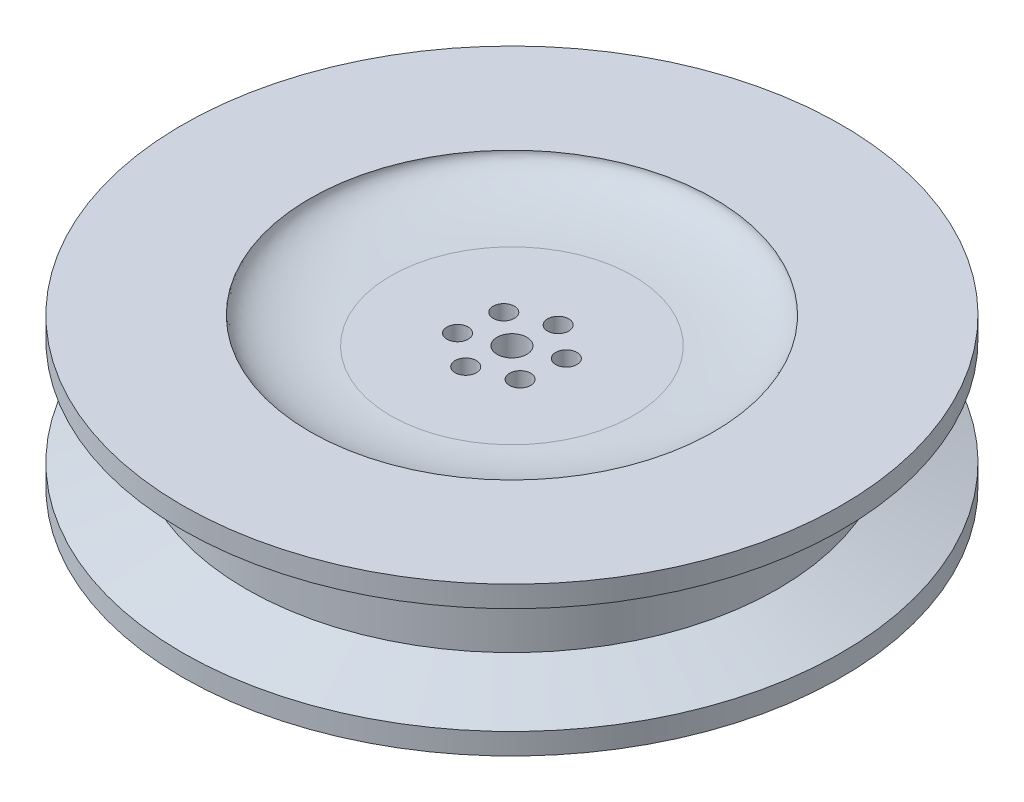
ISO-10303-21;
HEADER;
FILE_DESCRIPTION(('STEP AP214'),'2;1');
FILE_NAME('part.step','',(''),(''),'','','');
FILE_SCHEMA(('AUTOMOTIVE_DESIGN { 1 0 10303 214 1 1 1 1 }'));
ENDSEC;
DATA;
#1=APPLICATION_CONTEXT('core data for automotive mechanical design processes');
#2=APPLICATION_PROTOCOL_DEFINITION('international standard','automotive_design',2000,#1);
#3=PRODUCT_CONTEXT('',#1,'mechanical');
#4=PRODUCT('Part','Part','',(#3));
#5=PRODUCT_RELATED_PRODUCT_CATEGORY('part','',(#4));
#6=PRODUCT_DEFINITION_FORMATION('','',#4);
#7=PRODUCT_DEFINITION_CONTEXT('part definition',#1,'design');
#8=PRODUCT_DEFINITION('design','',#6,#7);
#9=PRODUCT_DEFINITION_SHAPE('','',#8);
#10=(LENGTH_UNIT() NAMED_UNIT(*) SI_UNIT(.MILLI.,.METRE.));
#11=(NAMED_UNIT(*) PLANE_ANGLE_UNIT() SI_UNIT($,.RADIAN.));
#12=(NAMED_UNIT(*) SI_UNIT($,.STERADIAN.) SOLID_ANGLE_UNIT());
#13=UNCERTAINTY_MEASURE_WITH_UNIT(LENGTH_MEASURE(1.E-05),#10,'distance_accuracy_value','');
#14=(GEOMETRIC_REPRESENTATION_CONTEXT(3) GLOBAL_UNCERTAINTY_ASSIGNED_CONTEXT((#13)) GLOBAL_UNIT_ASSIGNED_CONTEXT((#10,
#11,#12)) REPRESENTATION_CONTEXT('',''));
#15=CARTESIAN_POINT('',(0.,0.,0.));
#16=DIRECTION('',(0.,0.,1.));
#17=DIRECTION('',(1.,0.,0.));
#18=AXIS2_PLACEMENT_3D('',#15,#16,#17);
#19=CARTESIAN_POINT('',(-31.,-1.86496753872252,0.));
#20=DIRECTION('',(0.,-1.,0.));
#21=DIRECTION('',(0.,0.,-1.));
#22=AXIS2_PLACEMENT_3D('',#19,#20,#21);
#23=PLANE('',#22);
#24=CARTESIAN_POINT('',(0.,-1.86496753872252,0.));
#25=DIRECTION('',(0.,1.,0.));
#26=DIRECTION('',(0.,0.,1.));
#27=AXIS2_PLACEMENT_3D('',#24,#25,#26);
#28=CIRCLE('',#27,19.);
#29=CARTESIAN_POINT('',(0.,-1.86496753872252,19.));
#30=VERTEX_POINT('',#29);
#31=EDGE_CURVE('E10',#30,#30,#28,.T.);
#32=ORIENTED_EDGE('',*,*,#31,.T.);
#33=EDGE_LOOP('',(#32));
#34=FACE_BOUND('',#33,.T.);
#35=CARTESIAN_POINT('',(0.,-1.86496753872252,0.));
#36=DIRECTION('',(0.,1.,0.));
#37=DIRECTION('',(0.,0.,1.));
#38=AXIS2_PLACEMENT_3D('',#35,#36,#37);
#39=CIRCLE('',#38,31.);
#40=CARTESIAN_POINT('',(0.,-1.86496753872252,31.));
#41=VERTEX_POINT('',#40);
#42=EDGE_CURVE('E92',#41,#41,#39,.T.);
#43=ORIENTED_EDGE('',*,*,#42,.F.);
#44=EDGE_LOOP('',(#43));
#45=FACE_BOUND('',#44,.T.);
#46=ADVANCED_FACE('F41',(#34,#45),#23,.T.);
#47=CARTESIAN_POINT('',(-11.4,-1.86496753872251,0.));
#48=DIRECTION('',(0.,0.,-1.));
#49=DIRECTION('',(-1.,0.,0.));
#50=AXIS2_PLACEMENT_3D('',#47,#48,#49);
#51=ELLIPSE('',#50,7.60000000000001,2.5);
#52=CARTESIAN_POINT('',(0.,6.22360430362788,0.));
#53=DIRECTION('',(0.,1.,0.));
#54=AXIS1_PLACEMENT('',#52,#53);
#55=SURFACE_OF_REVOLUTION('',#51,#54);
#56=CARTESIAN_POINT('',(0.,0.635032461277484,0.));
#57=DIRECTION('',(0.,1.,0.));
#58=DIRECTION('',(0.,0.,1.));
#59=AXIS2_PLACEMENT_3D('',#56,#57,#58);
#60=CIRCLE('',#59,11.4);
#61=CARTESIAN_POINT('',(0.,0.635032461277484,11.4));
#62=VERTEX_POINT('',#61);
#63=EDGE_CURVE('E48',#62,#62,#60,.T.);
#64=ORIENTED_EDGE('',*,*,#63,.T.);
#65=EDGE_LOOP('',(#64));
#66=FACE_BOUND('',#65,.T.);
#67=ORIENTED_EDGE('',*,*,#31,.F.);
#68=EDGE_LOOP('',(#67));
#69=FACE_BOUND('',#68,.T.);
#70=ADVANCED_FACE('F119',(#66,#69),#55,.F.);
#71=CARTESIAN_POINT('',(-11.4,0.635032461277484,0.));
#72=DIRECTION('',(0.,-1.,0.));
#73=DIRECTION('',(0.,0.,-1.));
#74=AXIS2_PLACEMENT_3D('',#71,#72,#73);
#75=PLANE('',#74);
#76=CARTESIAN_POINT('',(-3.58972928498917,0.635032461277484,1.5244158423769));
#77=DIRECTION('',(0.,-1.,0.));
#78=DIRECTION('',(0.,0.,-1.));
#79=AXIS2_PLACEMENT_3D('',#76,#77,#78);
#80=CIRCLE('',#79,1.00000000000002);
#81=CARTESIAN_POINT('',(-3.58972928498917,0.635032461277484,0.524415842376878));
#82=VERTEX_POINT('',#81);
#83=EDGE_CURVE('E96',#82,#82,#80,.T.);
#84=ORIENTED_EDGE('',*,*,#83,.F.);
#85=EDGE_LOOP('',(#84));
#86=FACE_BOUND('',#85,.T.);
#87=CARTESIAN_POINT('',(-0.474681797064522,0.635032461277484,3.87100467469805));
#88=DIRECTION('',(0.,-1.,0.));
#89=DIRECTION('',(0.,0.,-1.));
#90=AXIS2_PLACEMENT_3D('',#87,#88,#89);
#91=CIRCLE('',#90,1.00000000000019);
#92=CARTESIAN_POINT('',(-0.474681797064522,0.635032461277484,2.87100467469786));
#93=VERTEX_POINT('',#92);
#94=EDGE_CURVE('E372',#93,#93,#91,.T.);
#95=ORIENTED_EDGE('',*,*,#94,.F.);
#96=EDGE_LOOP('',(#95));
#97=FACE_BOUND('',#96,.T.);
#98=CARTESIAN_POINT('',(3.11504748792478,0.635032461277484,2.34658883232098));
#99=DIRECTION('',(0.,-1.,0.));
#100=DIRECTION('',(0.,0.,-1.));
#101=AXIS2_PLACEMENT_3D('',#98,#99,#100);
#102=CIRCLE('',#101,1.00000000000038);
#103=CARTESIAN_POINT('',(3.11504748792478,0.635032461277484,1.3465888323206));
#104=VERTEX_POINT('',#103);
#105=EDGE_CURVE('E368',#104,#104,#102,.T.);
#106=ORIENTED_EDGE('',*,*,#105,.F.);
#107=EDGE_LOOP('',(#106));
#108=FACE_BOUND('',#107,.T.);
#109=CARTESIAN_POINT('',(3.58972928498944,0.635032461277484,-1.52441584237724));
#110=DIRECTION('',(0.,-1.,0.));
#111=DIRECTION('',(0.,0.,-1.));
#112=AXIS2_PLACEMENT_3D('',#109,#110,#111);
#113=CIRCLE('',#112,1.00000000000039);
#114=CARTESIAN_POINT('',(3.58972928498944,0.635032461277484,-2.52441584237764));
#115=VERTEX_POINT('',#114);
#116=EDGE_CURVE('E364',#115,#115,#113,.T.);
#117=ORIENTED_EDGE('',*,*,#116,.F.);
#118=EDGE_LOOP('',(#117));
#119=FACE_BOUND('',#118,.T.);
#120=CARTESIAN_POINT('',(0.474681797064789,0.635032461277484,-3.8710046746984));
#121=DIRECTION('',(0.,-1.,0.));
#122=DIRECTION('',(0.,0.,-1.));
#123=AXIS2_PLACEMENT_3D('',#120,#121,#122);
#124=CIRCLE('',#123,1.00000000000021);
#125=CARTESIAN_POINT('',(0.474681797064789,0.635032461277484,-4.8710046746986));
#126=VERTEX_POINT('',#125);
#127=EDGE_CURVE('E360',#126,#126,#124,.T.);
#128=ORIENTED_EDGE('',*,*,#127,.F.);
#129=EDGE_LOOP('',(#128));
#130=FACE_BOUND('',#129,.T.);
#131=CARTESIAN_POINT('',(-3.11504748792451,0.635032461277484,-2.34658883232133));
#132=DIRECTION('',(0.,-1.,0.));
#133=DIRECTION('',(0.,0.,-1.));
#134=AXIS2_PLACEMENT_3D('',#131,#132,#133);
#135=CIRCLE('',#134,1.);
#136=CARTESIAN_POINT('',(-3.11504748792451,0.635032461277484,-3.34658883232133));
#137=VERTEX_POINT('',#136);
#138=EDGE_CURVE('E355',#137,#137,#135,.T.);
#139=ORIENTED_EDGE('',*,*,#138,.F.);
#140=EDGE_LOOP('',(#139));
#141=FACE_BOUND('',#140,.T.);
#142=CARTESIAN_POINT('',(0.,0.635032461277484,0.));
#143=DIRECTION('',(0.,1.,0.));
#144=DIRECTION('',(0.,0.,1.));
#145=AXIS2_PLACEMENT_3D('',#142,#143,#144);
#146=CIRCLE('',#145,1.4);
#147=CARTESIAN_POINT('',(0.,0.635032461277484,1.4));
#148=VERTEX_POINT('',#147);
#149=EDGE_CURVE('E53',#148,#148,#146,.T.);
#150=ORIENTED_EDGE('',*,*,#149,.T.);
#151=EDGE_LOOP('',(#150));
#152=FACE_BOUND('',#151,.T.);
#153=ORIENTED_EDGE('',*,*,#63,.F.);
#154=EDGE_LOOP('',(#153));
#155=FACE_BOUND('',#154,.T.);
#156=ADVANCED_FACE('F116',(#86,#97,#108,#119,#130,#141,#152,#155),#75,.T.);
#157=CARTESIAN_POINT('',(0.,6.22360430362788,0.));
#158=DIRECTION('',(0.,1.,0.));
#159=DIRECTION('',(0.,0.,1.));
#160=AXIS2_PLACEMENT_3D('',#157,#158,#159);
#161=CYLINDRICAL_SURFACE('',#160,1.4);
#162=CARTESIAN_POINT('',(0.,9.63503246127748,0.));
#163=DIRECTION('',(0.,1.,0.));
#164=DIRECTION('',(0.,0.,1.));
#165=AXIS2_PLACEMENT_3D('',#162,#163,#164);
#166=CIRCLE('',#165,1.4);
#167=CARTESIAN_POINT('',(0.,9.63503246127748,1.4));
#168=VERTEX_POINT('',#167);
#169=EDGE_CURVE('E58',#168,#168,#166,.T.);
#170=ORIENTED_EDGE('',*,*,#169,.T.);
#171=EDGE_LOOP('',(#170));
#172=FACE_BOUND('',#171,.T.);
#173=ORIENTED_EDGE('',*,*,#149,.F.);
#174=EDGE_LOOP('',(#173));
#175=FACE_BOUND('',#174,.T.);
#176=ADVANCED_FACE('F112',(#172,#175),#161,.F.);
#177=CARTESIAN_POINT('',(-11.4,9.63503246127748,0.));
#178=DIRECTION('',(0.,1.,0.));
#179=DIRECTION('',(0.,0.,1.));
#180=AXIS2_PLACEMENT_3D('',#177,#178,#179);
#181=PLANE('',#180);
#182=CARTESIAN_POINT('',(-3.58972928498917,9.63503246127748,1.5244158423769));
#183=DIRECTION('',(0.,1.,0.));
#184=DIRECTION('',(0.,0.,1.));
#185=AXIS2_PLACEMENT_3D('',#182,#183,#184);
#186=CIRCLE('',#185,1.00000000000002);
#187=CARTESIAN_POINT('',(-3.58972928498917,9.63503246127748,2.52441584237691));
#188=VERTEX_POINT('',#187);
#189=EDGE_CURVE('E341',#188,#188,#186,.T.);
#190=ORIENTED_EDGE('',*,*,#189,.F.);
#191=EDGE_LOOP('',(#190));
#192=FACE_BOUND('',#191,.T.);
#193=CARTESIAN_POINT('',(-0.474681797064522,9.63503246127748,3.87100467469805));
#194=DIRECTION('',(0.,1.,0.));
#195=DIRECTION('',(0.,0.,1.));
#196=AXIS2_PLACEMENT_3D('',#193,#194,#195);
#197=CIRCLE('',#196,1.00000000000019);
#198=CARTESIAN_POINT('',(-0.474681797064522,9.63503246127748,4.87100467469824));
#199=VERTEX_POINT('',#198);
#200=EDGE_CURVE('E343',#199,#199,#197,.T.);
#201=ORIENTED_EDGE('',*,*,#200,.F.);
#202=EDGE_LOOP('',(#201));
#203=FACE_BOUND('',#202,.T.);
#204=CARTESIAN_POINT('',(3.11504748792478,9.63503246127748,2.34658883232098));
#205=DIRECTION('',(0.,1.,0.));
#206=DIRECTION('',(0.,0.,1.));
#207=AXIS2_PLACEMENT_3D('',#204,#205,#206);
#208=CIRCLE('',#207,1.00000000000038);
#209=CARTESIAN_POINT('',(3.11504748792478,9.63503246127748,3.34658883232136));
#210=VERTEX_POINT('',#209);
#211=EDGE_CURVE('E347',#210,#210,#208,.T.);
#212=ORIENTED_EDGE('',*,*,#211,.F.);
#213=EDGE_LOOP('',(#212));
#214=FACE_BOUND('',#213,.T.);
#215=CARTESIAN_POINT('',(3.58972928498944,9.63503246127748,-1.52441584237724));
#216=DIRECTION('',(0.,1.,0.));
#217=DIRECTION('',(0.,0.,1.));
#218=AXIS2_PLACEMENT_3D('',#215,#216,#217);
#219=CIRCLE('',#218,1.00000000000039);
#220=CARTESIAN_POINT('',(3.58972928498944,9.63503246127748,-0.524415842376848));
#221=VERTEX_POINT('',#220);
#222=EDGE_CURVE('E379',#221,#221,#219,.T.);
#223=ORIENTED_EDGE('',*,*,#222,.F.);
#224=EDGE_LOOP('',(#223));
#225=FACE_BOUND('',#224,.T.);
#226=CARTESIAN_POINT('',(0.474681797064789,9.63503246127748,-3.8710046746984));
#227=DIRECTION('',(0.,1.,0.));
#228=DIRECTION('',(0.,0.,1.));
#229=AXIS2_PLACEMENT_3D('',#226,#227,#228);
#230=CIRCLE('',#229,1.00000000000021);
#231=CARTESIAN_POINT('',(0.474681797064789,9.63503246127748,-2.87100467469819));
#232=VERTEX_POINT('',#231);
#233=EDGE_CURVE('E356',#232,#232,#230,.T.);
#234=ORIENTED_EDGE('',*,*,#233,.F.);
#235=EDGE_LOOP('',(#234));
#236=FACE_BOUND('',#235,.T.);
#237=CARTESIAN_POINT('',(-3.11504748792451,9.63503246127748,-2.34658883232133));
#238=DIRECTION('',(0.,1.,0.));
#239=DIRECTION('',(0.,0.,1.));
#240=AXIS2_PLACEMENT_3D('',#237,#238,#239);
#241=CIRCLE('',#240,1.);
#242=CARTESIAN_POINT('',(-3.11504748792451,9.63503246127748,-1.34658883232133));
#243=VERTEX_POINT('',#242);
#244=EDGE_CURVE('E351',#243,#243,#241,.T.);
#245=ORIENTED_EDGE('',*,*,#244,.F.);
#246=EDGE_LOOP('',(#245));
#247=FACE_BOUND('',#246,.T.);
#248=CARTESIAN_POINT('',(0.,9.63503246127748,0.));
#249=DIRECTION('',(0.,1.,0.));
#250=DIRECTION('',(0.,0.,1.));
#251=AXIS2_PLACEMENT_3D('',#248,#249,#250);
#252=CIRCLE('',#251,11.4);
#253=CARTESIAN_POINT('',(0.,9.63503246127748,11.4));
#254=VERTEX_POINT('',#253);
#255=EDGE_CURVE('E64',#254,#254,#252,.T.);
#256=ORIENTED_EDGE('',*,*,#255,.T.);
#257=EDGE_LOOP('',(#256));
#258=FACE_BOUND('',#257,.T.);
#259=ORIENTED_EDGE('',*,*,#169,.F.);
#260=EDGE_LOOP('',(#259));
#261=FACE_BOUND('',#260,.T.);
#262=ADVANCED_FACE('F107',(#192,#203,#214,#225,#236,#247,#258,#261),#181,.T.);
#263=CARTESIAN_POINT('',(-11.4,12.1350324612775,0.));
#264=DIRECTION('',(0.,0.,-1.));
#265=DIRECTION('',(-1.,0.,0.));
#266=AXIS2_PLACEMENT_3D('',#263,#264,#265);
#267=ELLIPSE('',#266,7.6,2.5);
#268=CARTESIAN_POINT('',(0.,6.22360430362788,0.));
#269=DIRECTION('',(0.,1.,0.));
#270=AXIS1_PLACEMENT('',#268,#269);
#271=SURFACE_OF_REVOLUTION('',#267,#270);
#272=CARTESIAN_POINT('',(0.,12.1350324612775,0.));
#273=DIRECTION('',(0.,1.,0.));
#274=DIRECTION('',(0.,0.,1.));
#275=AXIS2_PLACEMENT_3D('',#272,#273,#274);
#276=CIRCLE('',#275,19.);
#277=CARTESIAN_POINT('',(0.,12.1350324612775,19.));
#278=VERTEX_POINT('',#277);
#279=EDGE_CURVE('E68',#278,#278,#276,.T.);
#280=ORIENTED_EDGE('',*,*,#279,.T.);
#281=EDGE_LOOP('',(#280));
#282=FACE_BOUND('',#281,.T.);
#283=ORIENTED_EDGE('',*,*,#255,.F.);
#284=EDGE_LOOP('',(#283));
#285=FACE_BOUND('',#284,.T.);
#286=ADVANCED_FACE('F102',(#282,#285),#271,.F.);
#287=CARTESIAN_POINT('',(-31.,12.1350324612775,0.));
#288=DIRECTION('',(0.,1.,0.));
#289=DIRECTION('',(0.,0.,1.));
#290=AXIS2_PLACEMENT_3D('',#287,#288,#289);
#291=PLANE('',#290);
#292=CARTESIAN_POINT('',(0.,12.1350324612775,0.));
#293=DIRECTION('',(0.,1.,0.));
#294=DIRECTION('',(0.,0.,1.));
#295=AXIS2_PLACEMENT_3D('',#292,#293,#294);
#296=CIRCLE('',#295,31.);
#297=CARTESIAN_POINT('',(0.,12.1350324612775,31.));
#298=VERTEX_POINT('',#297);
#299=EDGE_CURVE('E72',#298,#298,#296,.T.);
#300=ORIENTED_EDGE('',*,*,#299,.T.);
#301=EDGE_LOOP('',(#300));
#302=FACE_BOUND('',#301,.T.);
#303=ORIENTED_EDGE('',*,*,#279,.F.);
#304=EDGE_LOOP('',(#303));
#305=FACE_BOUND('',#304,.T.);
#306=ADVANCED_FACE('F106',(#302,#305),#291,.T.);
#307=CARTESIAN_POINT('',(0.,6.22360430362788,0.));
#308=DIRECTION('',(0.,1.,0.));
#309=DIRECTION('',(0.,0.,1.));
#310=AXIS2_PLACEMENT_3D('',#307,#308,#309);
#311=CYLINDRICAL_SURFACE('',#310,31.);
#312=CARTESIAN_POINT('',(0.,10.1350324612775,0.));
#313=DIRECTION('',(0.,1.,0.));
#314=DIRECTION('',(0.,0.,1.));
#315=AXIS2_PLACEMENT_3D('',#312,#313,#314);
#316=CIRCLE('',#315,31.);
#317=CARTESIAN_POINT('',(0.,10.1350324612775,31.));
#318=VERTEX_POINT('',#317);
#319=EDGE_CURVE('E76',#318,#318,#316,.T.);
#320=ORIENTED_EDGE('',*,*,#319,.T.);
#321=EDGE_LOOP('',(#320));
#322=FACE_BOUND('',#321,.T.);
#323=ORIENTED_EDGE('',*,*,#299,.F.);
#324=EDGE_LOOP('',(#323));
#325=FACE_BOUND('',#324,.T.);
#326=ADVANCED_FACE('F153',(#322,#325),#311,.T.);
#327=CARTESIAN_POINT('',(0.,10.1350324612775,0.));
#328=DIRECTION('',(0.,1.,0.));
#329=DIRECTION('',(0.,0.,1.));
#330=AXIS2_PLACEMENT_3D('',#327,#328,#329);
#331=CONICAL_SURFACE('',#330,31.,1.22155703317297);
#332=CARTESIAN_POINT('',(0.,7.95003246127748,0.));
#333=DIRECTION('',(0.,1.,0.));
#334=DIRECTION('',(0.,0.,1.));
#335=AXIS2_PLACEMENT_3D('',#332,#333,#334);
#336=CIRCLE('',#335,25.);
#337=CARTESIAN_POINT('',(0.,7.95003246127748,25.));
#338=VERTEX_POINT('',#337);
#339=EDGE_CURVE('E80',#338,#338,#336,.T.);
#340=ORIENTED_EDGE('',*,*,#339,.T.);
#341=EDGE_LOOP('',(#340));
#342=FACE_BOUND('',#341,.T.);
#343=ORIENTED_EDGE('',*,*,#319,.F.);
#344=EDGE_LOOP('',(#343));
#345=FACE_BOUND('',#344,.T.);
#346=ADVANCED_FACE('F147',(#342,#345),#331,.T.);
#347=CARTESIAN_POINT('',(0.,6.22360430362788,0.));
#348=DIRECTION('',(0.,1.,0.));
#349=DIRECTION('',(0.,0.,1.));
#350=AXIS2_PLACEMENT_3D('',#347,#348,#349);
#351=CYLINDRICAL_SURFACE('',#350,25.);
#352=CARTESIAN_POINT('',(0.,2.32003246127749,0.));
#353=DIRECTION('',(0.,1.,0.));
#354=DIRECTION('',(0.,0.,1.));
#355=AXIS2_PLACEMENT_3D('',#352,#353,#354);
#356=CIRCLE('',#355,25.);
#357=CARTESIAN_POINT('',(0.,2.32003246127749,25.));
#358=VERTEX_POINT('',#357);
#359=EDGE_CURVE('E84',#358,#358,#356,.T.);
#360=ORIENTED_EDGE('',*,*,#359,.T.);
#361=EDGE_LOOP('',(#360));
#362=FACE_BOUND('',#361,.T.);
#363=ORIENTED_EDGE('',*,*,#339,.F.);
#364=EDGE_LOOP('',(#363));
#365=FACE_BOUND('',#364,.T.);
#366=ADVANCED_FACE('F141',(#362,#365),#351,.T.);
#367=CARTESIAN_POINT('',(0.,2.32003246127749,0.));
#368=DIRECTION('',(0.,-1.,0.));
#369=DIRECTION('',(0.,0.,-1.));
#370=AXIS2_PLACEMENT_3D('',#367,#368,#369);
#371=CONICAL_SURFACE('',#370,25.,1.22155703317297);
#372=CARTESIAN_POINT('',(0.,0.135032461277485,0.));
#373=DIRECTION('',(0.,1.,0.));
#374=DIRECTION('',(0.,0.,1.));
#375=AXIS2_PLACEMENT_3D('',#372,#373,#374);
#376=CIRCLE('',#375,31.);
#377=CARTESIAN_POINT('',(0.,0.135032461277485,31.));
#378=VERTEX_POINT('',#377);
#379=EDGE_CURVE('E88',#378,#378,#376,.T.);
#380=ORIENTED_EDGE('',*,*,#379,.T.);
#381=EDGE_LOOP('',(#380));
#382=FACE_BOUND('',#381,.T.);
#383=ORIENTED_EDGE('',*,*,#359,.F.);
#384=EDGE_LOOP('',(#383));
#385=FACE_BOUND('',#384,.T.);
#386=ADVANCED_FACE('F135',(#382,#385),#371,.T.);
#387=CARTESIAN_POINT('',(0.,6.22360430362788,0.));
#388=DIRECTION('',(0.,1.,0.));
#389=DIRECTION('',(0.,0.,1.));
#390=AXIS2_PLACEMENT_3D('',#387,#388,#389);
#391=CYLINDRICAL_SURFACE('',#390,31.);
#392=ORIENTED_EDGE('',*,*,#42,.T.);
#393=EDGE_LOOP('',(#392));
#394=FACE_BOUND('',#393,.T.);
#395=ORIENTED_EDGE('',*,*,#379,.F.);
#396=EDGE_LOOP('',(#395));
#397=FACE_BOUND('',#396,.T.);
#398=ADVANCED_FACE('F131',(#394,#397),#391,.T.);
#399=CARTESIAN_POINT('',(-3.11504748792451,-0.364967538722515,-2.34658883232133));
#400=DIRECTION('',(0.,1.,0.));
#401=DIRECTION('',(0.,0.,1.));
#402=AXIS2_PLACEMENT_3D('',#399,#400,#401);
#403=CYLINDRICAL_SURFACE('',#402,1.);
#404=ORIENTED_EDGE('',*,*,#138,.T.);
#405=EDGE_LOOP('',(#404));
#406=FACE_BOUND('',#405,.T.);
#407=ORIENTED_EDGE('',*,*,#244,.T.);
#408=EDGE_LOOP('',(#407));
#409=FACE_BOUND('',#408,.T.);
#410=ADVANCED_FACE('F134',(#406,#409),#403,.F.);
#411=CARTESIAN_POINT('',(0.474681797064789,-0.364967538722515,-3.8710046746984));
#412=DIRECTION('',(0.,1.,0.));
#413=DIRECTION('',(0.,0.,1.));
#414=AXIS2_PLACEMENT_3D('',#411,#412,#413);
#415=CYLINDRICAL_SURFACE('',#414,1.00000000000021);
#416=ORIENTED_EDGE('',*,*,#127,.T.);
#417=EDGE_LOOP('',(#416));
#418=FACE_BOUND('',#417,.T.);
#419=ORIENTED_EDGE('',*,*,#233,.T.);
#420=EDGE_LOOP('',(#419));
#421=FACE_BOUND('',#420,.T.);
#422=ADVANCED_FACE('F204',(#418,#421),#415,.F.);
#423=CARTESIAN_POINT('',(3.58972928498944,-0.364967538722515,-1.52441584237724));
#424=DIRECTION('',(0.,1.,0.));
#425=DIRECTION('',(0.,0.,1.));
#426=AXIS2_PLACEMENT_3D('',#423,#424,#425);
#427=CYLINDRICAL_SURFACE('',#426,1.00000000000039);
#428=ORIENTED_EDGE('',*,*,#116,.T.);
#429=EDGE_LOOP('',(#428));
#430=FACE_BOUND('',#429,.T.);
#431=ORIENTED_EDGE('',*,*,#222,.T.);
#432=EDGE_LOOP('',(#431));
#433=FACE_BOUND('',#432,.T.);
#434=ADVANCED_FACE('F213',(#430,#433),#427,.F.);
#435=CARTESIAN_POINT('',(3.11504748792478,-0.364967538722515,2.34658883232098));
#436=DIRECTION('',(0.,1.,0.));
#437=DIRECTION('',(0.,0.,1.));
#438=AXIS2_PLACEMENT_3D('',#435,#436,#437);
#439=CYLINDRICAL_SURFACE('',#438,1.00000000000038);
#440=ORIENTED_EDGE('',*,*,#105,.T.);
#441=EDGE_LOOP('',(#440));
#442=FACE_BOUND('',#441,.T.);
#443=ORIENTED_EDGE('',*,*,#211,.T.);
#444=EDGE_LOOP('',(#443));
#445=FACE_BOUND('',#444,.T.);
#446=ADVANCED_FACE('F221',(#442,#445),#439,.F.);
#447=CARTESIAN_POINT('',(-0.474681797064522,-0.364967538722515,3.87100467469805));
#448=DIRECTION('',(0.,1.,0.));
#449=DIRECTION('',(0.,0.,1.));
#450=AXIS2_PLACEMENT_3D('',#447,#448,#449);
#451=CYLINDRICAL_SURFACE('',#450,1.00000000000019);
#452=ORIENTED_EDGE('',*,*,#94,.T.);
#453=EDGE_LOOP('',(#452));
#454=FACE_BOUND('',#453,.T.);
#455=ORIENTED_EDGE('',*,*,#200,.T.);
#456=EDGE_LOOP('',(#455));
#457=FACE_BOUND('',#456,.T.);
#458=ADVANCED_FACE('F229',(#454,#457),#451,.F.);
#459=CARTESIAN_POINT('',(-3.58972928498917,-0.364967538722515,1.5244158423769));
#460=DIRECTION('',(0.,1.,0.));
#461=DIRECTION('',(0.,0.,1.));
#462=AXIS2_PLACEMENT_3D('',#459,#460,#461);
#463=CYLINDRICAL_SURFACE('',#462,1.00000000000002);
#464=ORIENTED_EDGE('',*,*,#83,.T.);
#465=EDGE_LOOP('',(#464));
#466=FACE_BOUND('',#465,.T.);
#467=ORIENTED_EDGE('',*,*,#189,.T.);
#468=EDGE_LOOP('',(#467));
#469=FACE_BOUND('',#468,.T.);
#470=ADVANCED_FACE('F237',(#466,#469),#463,.F.);
#471=CLOSED_SHELL('',(#46,#70,#156,#176,#262,#286,#306,#326,#346,#366,#386,#398,#410,#422,#434,
#446,#458,#470));
#472=MANIFOLD_SOLID_BREP('B2',#471);
#473=ADVANCED_BREP_SHAPE_REPRESENTATION('',(#18,#472),#14);
#474=SHAPE_DEFINITION_REPRESENTATION(#9,#473);
ENDSEC;
END-ISO-10303-21;
